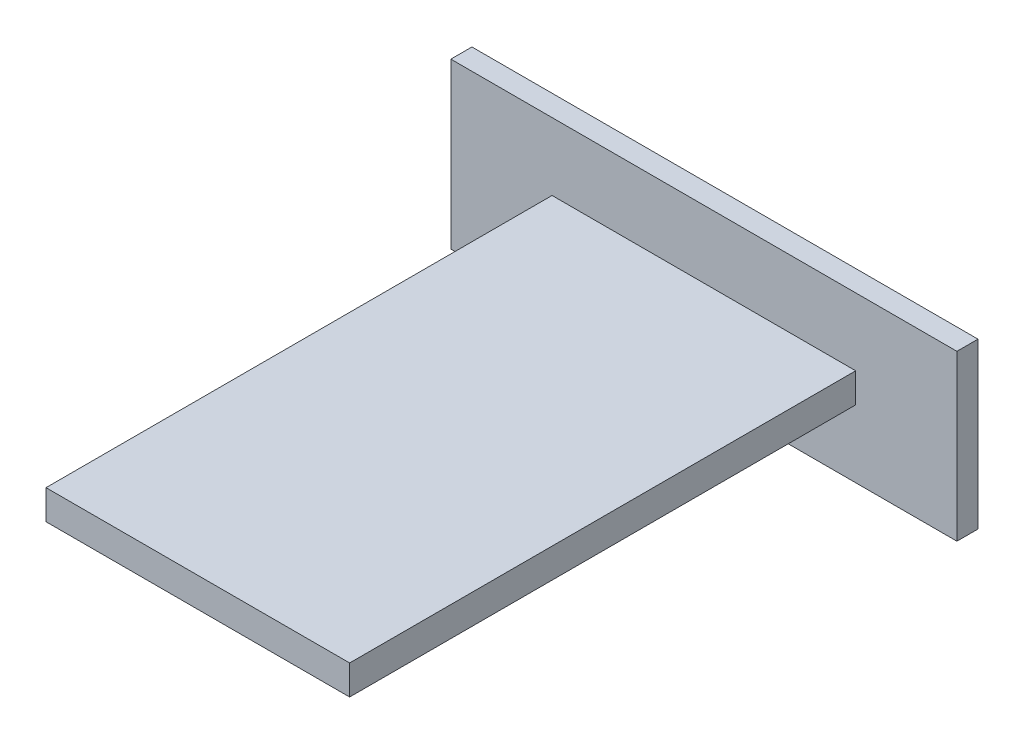
ISO-10303-21;
HEADER;
FILE_DESCRIPTION(('STEP AP214'),'2;1');
FILE_NAME('part.step','',(''),(''),'','','');
FILE_SCHEMA(('AUTOMOTIVE_DESIGN { 1 0 10303 214 1 1 1 1 }'));
ENDSEC;
DATA;
#1=APPLICATION_CONTEXT('core data for automotive mechanical design processes');
#2=APPLICATION_PROTOCOL_DEFINITION('international standard','automotive_design',2000,#1);
#3=PRODUCT_CONTEXT('',#1,'mechanical');
#4=PRODUCT('Part','Part','',(#3));
#5=PRODUCT_RELATED_PRODUCT_CATEGORY('part','',(#4));
#6=PRODUCT_DEFINITION_FORMATION('','',#4);
#7=PRODUCT_DEFINITION_CONTEXT('part definition',#1,'design');
#8=PRODUCT_DEFINITION('design','',#6,#7);
#9=PRODUCT_DEFINITION_SHAPE('','',#8);
#10=(LENGTH_UNIT() NAMED_UNIT(*) SI_UNIT(.MILLI.,.METRE.));
#11=(NAMED_UNIT(*) PLANE_ANGLE_UNIT() SI_UNIT($,.RADIAN.));
#12=(NAMED_UNIT(*) SI_UNIT($,.STERADIAN.) SOLID_ANGLE_UNIT());
#13=UNCERTAINTY_MEASURE_WITH_UNIT(LENGTH_MEASURE(1.E-05),#10,'distance_accuracy_value','');
#14=(GEOMETRIC_REPRESENTATION_CONTEXT(3) GLOBAL_UNCERTAINTY_ASSIGNED_CONTEXT((#13)) GLOBAL_UNIT_ASSIGNED_CONTEXT((#10,
#11,#12)) REPRESENTATION_CONTEXT('',''));
#15=CARTESIAN_POINT('',(0.,0.,0.));
#16=DIRECTION('',(0.,0.,1.));
#17=DIRECTION('',(1.,0.,0.));
#18=AXIS2_PLACEMENT_3D('',#15,#16,#17);
#19=CARTESIAN_POINT('',(9.,1.75,15.));
#20=DIRECTION('',(-1.,0.,0.));
#21=DIRECTION('',(0.,0.,1.));
#22=AXIS2_PLACEMENT_3D('',#19,#20,#21);
#23=PLANE('',#22);
#24=DIRECTION('',(0.,0.,-1.));
#25=VECTOR('',#24,1.);
#26=CARTESIAN_POINT('',(9.,0.,15.));
#27=LINE('',#26,#25);
#28=CARTESIAN_POINT('',(9.,0.,15.));
#29=VERTEX_POINT('',#28);
#30=CARTESIAN_POINT('',(9.,0.,-15.));
#31=VERTEX_POINT('',#30);
#32=EDGE_CURVE('E146',#29,#31,#27,.T.);
#33=ORIENTED_EDGE('',*,*,#32,.T.);
#34=DIRECTION('',(0.,-1.,0.));
#35=VECTOR('',#34,1.);
#36=CARTESIAN_POINT('',(9.,1.75,-15.));
#37=LINE('',#36,#35);
#38=CARTESIAN_POINT('',(9.,1.75,-15.));
#39=VERTEX_POINT('',#38);
#40=EDGE_CURVE('E11',#39,#31,#37,.T.);
#41=ORIENTED_EDGE('',*,*,#40,.F.);
#42=DIRECTION('',(0.,0.,-1.));
#43=VECTOR('',#42,1.);
#44=CARTESIAN_POINT('',(9.,1.75,15.));
#45=LINE('',#44,#43);
#46=CARTESIAN_POINT('',(9.,1.75,15.));
#47=VERTEX_POINT('',#46);
#48=EDGE_CURVE('E87',#47,#39,#45,.T.);
#49=ORIENTED_EDGE('',*,*,#48,.F.);
#50=DIRECTION('',(0.,-1.,0.));
#51=VECTOR('',#50,1.);
#52=CARTESIAN_POINT('',(9.,1.75,15.));
#53=LINE('',#52,#51);
#54=EDGE_CURVE('E165',#47,#29,#53,.T.);
#55=ORIENTED_EDGE('',*,*,#54,.T.);
#56=EDGE_LOOP('',(#33,#41,#49,#55));
#57=FACE_BOUND('',#56,.T.);
#58=ADVANCED_FACE('F45',(#57),#23,.F.);
#59=CARTESIAN_POINT('',(-9.,1.75,15.));
#60=DIRECTION('',(1.,0.,0.));
#61=DIRECTION('',(0.,0.,-1.));
#62=AXIS2_PLACEMENT_3D('',#59,#60,#61);
#63=PLANE('',#62);
#64=DIRECTION('',(0.,0.,1.));
#65=VECTOR('',#64,1.);
#66=CARTESIAN_POINT('',(-9.,0.,15.));
#67=LINE('',#66,#65);
#68=CARTESIAN_POINT('',(-9.,0.,-15.));
#69=VERTEX_POINT('',#68);
#70=CARTESIAN_POINT('',(-9.,0.,15.));
#71=VERTEX_POINT('',#70);
#72=EDGE_CURVE('E76',#69,#71,#67,.T.);
#73=ORIENTED_EDGE('',*,*,#72,.T.);
#74=DIRECTION('',(0.,-1.,0.));
#75=VECTOR('',#74,1.);
#76=CARTESIAN_POINT('',(-9.,1.75,15.));
#77=LINE('',#76,#75);
#78=CARTESIAN_POINT('',(-9.,1.75,15.));
#79=VERTEX_POINT('',#78);
#80=EDGE_CURVE('E176',#79,#71,#77,.T.);
#81=ORIENTED_EDGE('',*,*,#80,.F.);
#82=DIRECTION('',(0.,0.,1.));
#83=VECTOR('',#82,1.);
#84=CARTESIAN_POINT('',(-9.,1.75,15.));
#85=LINE('',#84,#83);
#86=CARTESIAN_POINT('',(-9.,1.75,-15.));
#87=VERTEX_POINT('',#86);
#88=EDGE_CURVE('E161',#87,#79,#85,.T.);
#89=ORIENTED_EDGE('',*,*,#88,.F.);
#90=DIRECTION('',(0.,-1.,0.));
#91=VECTOR('',#90,1.);
#92=CARTESIAN_POINT('',(-9.,1.75,-15.));
#93=LINE('',#92,#91);
#94=EDGE_CURVE('E54',#87,#69,#93,.T.);
#95=ORIENTED_EDGE('',*,*,#94,.T.);
#96=EDGE_LOOP('',(#73,#81,#89,#95));
#97=FACE_BOUND('',#96,.T.);
#98=ADVANCED_FACE('F181',(#97),#63,.F.);
#99=CARTESIAN_POINT('',(-9.,1.75,15.));
#100=DIRECTION('',(0.,0.,-1.));
#101=DIRECTION('',(-1.,0.,0.));
#102=AXIS2_PLACEMENT_3D('',#99,#100,#101);
#103=PLANE('',#102);
#104=DIRECTION('',(1.,0.,0.));
#105=VECTOR('',#104,1.);
#106=CARTESIAN_POINT('',(-9.,0.,15.));
#107=LINE('',#106,#105);
#108=EDGE_CURVE('E82',#71,#29,#107,.T.);
#109=ORIENTED_EDGE('',*,*,#108,.T.);
#110=ORIENTED_EDGE('',*,*,#54,.F.);
#111=DIRECTION('',(1.,0.,0.));
#112=VECTOR('',#111,1.);
#113=CARTESIAN_POINT('',(-9.,1.75,15.));
#114=LINE('',#113,#112);
#115=EDGE_CURVE('E62',#79,#47,#114,.T.);
#116=ORIENTED_EDGE('',*,*,#115,.F.);
#117=ORIENTED_EDGE('',*,*,#80,.T.);
#118=EDGE_LOOP('',(#109,#110,#116,#117));
#119=FACE_BOUND('',#118,.T.);
#120=ADVANCED_FACE('F191',(#119),#103,.F.);
#121=CARTESIAN_POINT('',(0.,1.75,0.));
#122=DIRECTION('',(0.,-1.,0.));
#123=DIRECTION('',(0.,0.,-1.));
#124=AXIS2_PLACEMENT_3D('',#121,#122,#123);
#125=PLANE('',#124);
#126=ORIENTED_EDGE('',*,*,#48,.T.);
#127=DIRECTION('',(-1.,0.,0.));
#128=VECTOR('',#127,1.);
#129=CARTESIAN_POINT('',(-9.,1.75,-15.));
#130=LINE('',#129,#128);
#131=EDGE_CURVE('E158',#39,#87,#130,.T.);
#132=ORIENTED_EDGE('',*,*,#131,.T.);
#133=ORIENTED_EDGE('',*,*,#88,.T.);
#134=ORIENTED_EDGE('',*,*,#115,.T.);
#135=EDGE_LOOP('',(#126,#132,#133,#134));
#136=FACE_BOUND('',#135,.T.);
#137=ADVANCED_FACE('F193',(#136),#125,.F.);
#138=CARTESIAN_POINT('',(0.,0.,0.));
#139=DIRECTION('',(0.,-1.,0.));
#140=DIRECTION('',(0.,0.,-1.));
#141=AXIS2_PLACEMENT_3D('',#138,#139,#140);
#142=PLANE('',#141);
#143=ORIENTED_EDGE('',*,*,#32,.F.);
#144=ORIENTED_EDGE('',*,*,#108,.F.);
#145=ORIENTED_EDGE('',*,*,#72,.F.);
#146=DIRECTION('',(-1.,0.,0.));
#147=VECTOR('',#146,1.);
#148=CARTESIAN_POINT('',(-9.,0.,-15.));
#149=LINE('',#148,#147);
#150=EDGE_CURVE('E150',#31,#69,#149,.T.);
#151=ORIENTED_EDGE('',*,*,#150,.F.);
#152=EDGE_LOOP('',(#143,#144,#145,#151));
#153=FACE_BOUND('',#152,.T.);
#154=ADVANCED_FACE('F187',(#153),#142,.T.);
#155=CARTESIAN_POINT('',(-15.,-4.,-16.25));
#156=DIRECTION('',(1.,0.,0.));
#157=DIRECTION('',(0.,0.,-1.));
#158=AXIS2_PLACEMENT_3D('',#155,#156,#157);
#159=PLANE('',#158);
#160=DIRECTION('',(0.,1.,0.));
#161=VECTOR('',#160,1.);
#162=CARTESIAN_POINT('',(-15.,-4.,-15.));
#163=LINE('',#162,#161);
#164=CARTESIAN_POINT('',(-15.,-4.,-15.));
#165=VERTEX_POINT('',#164);
#166=CARTESIAN_POINT('',(-15.,5.75,-15.));
#167=VERTEX_POINT('',#166);
#168=EDGE_CURVE('E144',#165,#167,#163,.T.);
#169=ORIENTED_EDGE('',*,*,#168,.T.);
#170=DIRECTION('',(0.,0.,1.));
#171=VECTOR('',#170,1.);
#172=CARTESIAN_POINT('',(-15.,5.75,-16.25));
#173=LINE('',#172,#171);
#174=CARTESIAN_POINT('',(-15.,5.75,-16.25));
#175=VERTEX_POINT('',#174);
#176=EDGE_CURVE('E122',#175,#167,#173,.T.);
#177=ORIENTED_EDGE('',*,*,#176,.F.);
#178=DIRECTION('',(0.,1.,0.));
#179=VECTOR('',#178,1.);
#180=CARTESIAN_POINT('',(-15.,-4.,-16.25));
#181=LINE('',#180,#179);
#182=CARTESIAN_POINT('',(-15.,-4.,-16.25));
#183=VERTEX_POINT('',#182);
#184=EDGE_CURVE('E130',#183,#175,#181,.T.);
#185=ORIENTED_EDGE('',*,*,#184,.F.);
#186=DIRECTION('',(0.,0.,1.));
#187=VECTOR('',#186,1.);
#188=CARTESIAN_POINT('',(-15.,-4.,-16.25));
#189=LINE('',#188,#187);
#190=EDGE_CURVE('E285',#183,#165,#189,.T.);
#191=ORIENTED_EDGE('',*,*,#190,.T.);
#192=EDGE_LOOP('',(#169,#177,#185,#191));
#193=FACE_BOUND('',#192,.T.);
#194=ADVANCED_FACE('F142',(#193),#159,.F.);
#195=CARTESIAN_POINT('',(15.,5.75,-16.25));
#196=DIRECTION('',(0.,-1.,0.));
#197=DIRECTION('',(0.,0.,-1.));
#198=AXIS2_PLACEMENT_3D('',#195,#196,#197);
#199=PLANE('',#198);
#200=DIRECTION('',(1.,0.,0.));
#201=VECTOR('',#200,1.);
#202=CARTESIAN_POINT('',(15.,5.75,-15.));
#203=LINE('',#202,#201);
#204=CARTESIAN_POINT('',(15.,5.75,-15.));
#205=VERTEX_POINT('',#204);
#206=EDGE_CURVE('E293',#167,#205,#203,.T.);
#207=ORIENTED_EDGE('',*,*,#206,.T.);
#208=DIRECTION('',(0.,0.,1.));
#209=VECTOR('',#208,1.);
#210=CARTESIAN_POINT('',(15.,5.75,-16.25));
#211=LINE('',#210,#209);
#212=CARTESIAN_POINT('',(15.,5.75,-16.25));
#213=VERTEX_POINT('',#212);
#214=EDGE_CURVE('E125',#213,#205,#211,.T.);
#215=ORIENTED_EDGE('',*,*,#214,.F.);
#216=DIRECTION('',(1.,0.,0.));
#217=VECTOR('',#216,1.);
#218=CARTESIAN_POINT('',(15.,5.75,-16.25));
#219=LINE('',#218,#217);
#220=EDGE_CURVE('E118',#175,#213,#219,.T.);
#221=ORIENTED_EDGE('',*,*,#220,.F.);
#222=ORIENTED_EDGE('',*,*,#176,.T.);
#223=EDGE_LOOP('',(#207,#215,#221,#222));
#224=FACE_BOUND('',#223,.T.);
#225=ADVANCED_FACE('F120',(#224),#199,.F.);
#226=CARTESIAN_POINT('',(15.,-4.,-16.25));
#227=DIRECTION('',(-1.,0.,0.));
#228=DIRECTION('',(0.,0.,1.));
#229=AXIS2_PLACEMENT_3D('',#226,#227,#228);
#230=PLANE('',#229);
#231=DIRECTION('',(0.,-1.,0.));
#232=VECTOR('',#231,1.);
#233=CARTESIAN_POINT('',(15.,-4.,-15.));
#234=LINE('',#233,#232);
#235=CARTESIAN_POINT('',(15.,-4.,-15.));
#236=VERTEX_POINT('',#235);
#237=EDGE_CURVE('E289',#205,#236,#234,.T.);
#238=ORIENTED_EDGE('',*,*,#237,.T.);
#239=DIRECTION('',(0.,0.,1.));
#240=VECTOR('',#239,1.);
#241=CARTESIAN_POINT('',(15.,-4.,-16.25));
#242=LINE('',#241,#240);
#243=CARTESIAN_POINT('',(15.,-4.,-16.25));
#244=VERTEX_POINT('',#243);
#245=EDGE_CURVE('E152',#244,#236,#242,.T.);
#246=ORIENTED_EDGE('',*,*,#245,.F.);
#247=DIRECTION('',(0.,-1.,0.));
#248=VECTOR('',#247,1.);
#249=CARTESIAN_POINT('',(15.,-4.,-16.25));
#250=LINE('',#249,#248);
#251=EDGE_CURVE('E129',#213,#244,#250,.T.);
#252=ORIENTED_EDGE('',*,*,#251,.F.);
#253=ORIENTED_EDGE('',*,*,#214,.T.);
#254=EDGE_LOOP('',(#238,#246,#252,#253));
#255=FACE_BOUND('',#254,.T.);
#256=ADVANCED_FACE('F234',(#255),#230,.F.);
#257=CARTESIAN_POINT('',(15.,-4.,-16.25));
#258=DIRECTION('',(0.,1.,0.));
#259=DIRECTION('',(0.,0.,1.));
#260=AXIS2_PLACEMENT_3D('',#257,#258,#259);
#261=PLANE('',#260);
#262=DIRECTION('',(-1.,0.,0.));
#263=VECTOR('',#262,1.);
#264=CARTESIAN_POINT('',(15.,-4.,-15.));
#265=LINE('',#264,#263);
#266=EDGE_CURVE('E140',#236,#165,#265,.T.);
#267=ORIENTED_EDGE('',*,*,#266,.T.);
#268=ORIENTED_EDGE('',*,*,#190,.F.);
#269=DIRECTION('',(-1.,0.,0.));
#270=VECTOR('',#269,1.);
#271=CARTESIAN_POINT('',(15.,-4.,-16.25));
#272=LINE('',#271,#270);
#273=EDGE_CURVE('E135',#244,#183,#272,.T.);
#274=ORIENTED_EDGE('',*,*,#273,.F.);
#275=ORIENTED_EDGE('',*,*,#245,.T.);
#276=EDGE_LOOP('',(#267,#268,#274,#275));
#277=FACE_BOUND('',#276,.T.);
#278=ADVANCED_FACE('F242',(#277),#261,.F.);
#279=CARTESIAN_POINT('',(0.,0.,-16.25));
#280=DIRECTION('',(0.,0.,1.));
#281=DIRECTION('',(1.,0.,0.));
#282=AXIS2_PLACEMENT_3D('',#279,#280,#281);
#283=PLANE('',#282);
#284=ORIENTED_EDGE('',*,*,#184,.T.);
#285=ORIENTED_EDGE('',*,*,#220,.T.);
#286=ORIENTED_EDGE('',*,*,#251,.T.);
#287=ORIENTED_EDGE('',*,*,#273,.T.);
#288=EDGE_LOOP('',(#284,#285,#286,#287));
#289=FACE_BOUND('',#288,.T.);
#290=ADVANCED_FACE('F133',(#289),#283,.F.);
#291=CARTESIAN_POINT('',(0.,0.,-15.));
#292=DIRECTION('',(0.,0.,1.));
#293=DIRECTION('',(1.,0.,0.));
#294=AXIS2_PLACEMENT_3D('',#291,#292,#293);
#295=PLANE('',#294);
#296=ORIENTED_EDGE('',*,*,#40,.T.);
#297=ORIENTED_EDGE('',*,*,#150,.T.);
#298=ORIENTED_EDGE('',*,*,#94,.F.);
#299=ORIENTED_EDGE('',*,*,#131,.F.);
#300=EDGE_LOOP('',(#296,#297,#298,#299));
#301=FACE_BOUND('',#300,.T.);
#302=ORIENTED_EDGE('',*,*,#168,.F.);
#303=ORIENTED_EDGE('',*,*,#266,.F.);
#304=ORIENTED_EDGE('',*,*,#237,.F.);
#305=ORIENTED_EDGE('',*,*,#206,.F.);
#306=EDGE_LOOP('',(#302,#303,#304,#305));
#307=FACE_BOUND('',#306,.T.);
#308=ADVANCED_FACE('F188',(#301,#307),#295,.T.);
#309=CLOSED_SHELL('',(#58,#98,#120,#137,#154,#194,#225,#256,#278,#290,#308));
#310=MANIFOLD_SOLID_BREP('B2',#309);
#311=ADVANCED_BREP_SHAPE_REPRESENTATION('',(#18,#310),#14);
#312=SHAPE_DEFINITION_REPRESENTATION(#9,#311);
ENDSEC;
END-ISO-10303-21;
